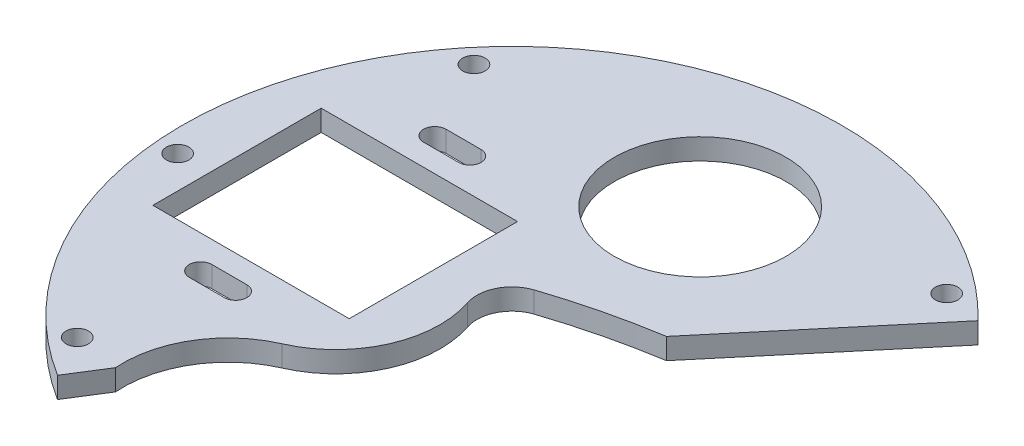
ISO-10303-21;
HEADER;
FILE_DESCRIPTION(('STEP AP214'),'2;1');
FILE_NAME('part.step','',(''),(''),'','','');
FILE_SCHEMA(('AUTOMOTIVE_DESIGN { 1 0 10303 214 1 1 1 1 }'));
ENDSEC;
DATA;
#1=APPLICATION_CONTEXT('core data for automotive mechanical design processes');
#2=APPLICATION_PROTOCOL_DEFINITION('international standard','automotive_design',2000,#1);
#3=PRODUCT_CONTEXT('',#1,'mechanical');
#4=PRODUCT('Part','Part','',(#3));
#5=PRODUCT_RELATED_PRODUCT_CATEGORY('part','',(#4));
#6=PRODUCT_DEFINITION_FORMATION('','',#4);
#7=PRODUCT_DEFINITION_CONTEXT('part definition',#1,'design');
#8=PRODUCT_DEFINITION('design','',#6,#7);
#9=PRODUCT_DEFINITION_SHAPE('','',#8);
#10=(LENGTH_UNIT() NAMED_UNIT(*) SI_UNIT(.MILLI.,.METRE.));
#11=(NAMED_UNIT(*) PLANE_ANGLE_UNIT() SI_UNIT($,.RADIAN.));
#12=(NAMED_UNIT(*) SI_UNIT($,.STERADIAN.) SOLID_ANGLE_UNIT());
#13=UNCERTAINTY_MEASURE_WITH_UNIT(LENGTH_MEASURE(1.E-05),#10,'distance_accuracy_value','');
#14=(GEOMETRIC_REPRESENTATION_CONTEXT(3) GLOBAL_UNCERTAINTY_ASSIGNED_CONTEXT((#13)) GLOBAL_UNIT_ASSIGNED_CONTEXT((#10,
#11,#12)) REPRESENTATION_CONTEXT('',''));
#15=CARTESIAN_POINT('',(0.,0.,0.));
#16=DIRECTION('',(0.,0.,1.));
#17=DIRECTION('',(1.,0.,0.));
#18=AXIS2_PLACEMENT_3D('',#15,#16,#17);
#19=CARTESIAN_POINT('',(0.,3.,15.1));
#20=DIRECTION('',(0.,0.,-1.));
#21=DIRECTION('',(-1.,0.,0.));
#22=AXIS2_PLACEMENT_3D('',#19,#20,#21);
#23=PLANE('',#22);
#24=DIRECTION('',(1.,0.,0.));
#25=VECTOR('',#24,1.);
#26=CARTESIAN_POINT('',(0.,0.,15.1));
#27=LINE('',#26,#25);
#28=CARTESIAN_POINT('',(-27.7045915678253,0.,15.1));
#29=VERTEX_POINT('',#28);
#30=CARTESIAN_POINT('',(-22.7045915678253,0.,15.1));
#31=VERTEX_POINT('',#30);
#32=EDGE_CURVE('E254',#29,#31,#27,.T.);
#33=ORIENTED_EDGE('',*,*,#32,.T.);
#34=DIRECTION('',(0.,-1.,0.));
#35=VECTOR('',#34,1.);
#36=CARTESIAN_POINT('',(-22.7045915678253,3.,15.1));
#37=LINE('',#36,#35);
#38=CARTESIAN_POINT('',(-22.7045915678253,3.,15.1));
#39=VERTEX_POINT('',#38);
#40=EDGE_CURVE('E11',#39,#31,#37,.T.);
#41=ORIENTED_EDGE('',*,*,#40,.F.);
#42=DIRECTION('',(1.,0.,0.));
#43=VECTOR('',#42,1.);
#44=CARTESIAN_POINT('',(0.,3.,15.1));
#45=LINE('',#44,#43);
#46=CARTESIAN_POINT('',(-27.7045915678253,3.,15.1));
#47=VERTEX_POINT('',#46);
#48=EDGE_CURVE('E178',#47,#39,#45,.T.);
#49=ORIENTED_EDGE('',*,*,#48,.F.);
#50=DIRECTION('',(0.,-1.,0.));
#51=VECTOR('',#50,1.);
#52=CARTESIAN_POINT('',(-27.7045915678253,3.,15.1));
#53=LINE('',#52,#51);
#54=EDGE_CURVE('E271',#47,#29,#53,.T.);
#55=ORIENTED_EDGE('',*,*,#54,.T.);
#56=EDGE_LOOP('',(#33,#41,#49,#55));
#57=FACE_BOUND('',#56,.T.);
#58=ADVANCED_FACE('F34',(#57),#23,.F.);
#59=CARTESIAN_POINT('',(-22.7045915678253,3.,16.7));
#60=DIRECTION('',(0.,-1.,0.));
#61=DIRECTION('',(0.,0.,-1.));
#62=AXIS2_PLACEMENT_3D('',#59,#60,#61);
#63=CYLINDRICAL_SURFACE('',#62,1.6);
#64=CARTESIAN_POINT('',(-22.7045915678253,0.,16.7));
#65=DIRECTION('',(0.,1.,0.));
#66=DIRECTION('',(0.,0.,1.));
#67=AXIS2_PLACEMENT_3D('',#64,#65,#66);
#68=CIRCLE('',#67,1.6);
#69=CARTESIAN_POINT('',(-22.7045915678253,0.,18.3));
#70=VERTEX_POINT('',#69);
#71=EDGE_CURVE('E184',#31,#70,#68,.F.);
#72=ORIENTED_EDGE('',*,*,#71,.T.);
#73=DIRECTION('',(0.,-1.,0.));
#74=VECTOR('',#73,1.);
#75=CARTESIAN_POINT('',(-22.7045915678253,3.,18.3));
#76=LINE('',#75,#74);
#77=CARTESIAN_POINT('',(-22.7045915678253,3.,18.3));
#78=VERTEX_POINT('',#77);
#79=EDGE_CURVE('E44',#78,#70,#76,.T.);
#80=ORIENTED_EDGE('',*,*,#79,.F.);
#81=CARTESIAN_POINT('',(-22.7045915678253,3.,16.7));
#82=DIRECTION('',(0.,1.,0.));
#83=DIRECTION('',(0.,0.,1.));
#84=AXIS2_PLACEMENT_3D('',#81,#82,#83);
#85=CIRCLE('',#84,1.6);
#86=EDGE_CURVE('E171',#39,#78,#85,.F.);
#87=ORIENTED_EDGE('',*,*,#86,.F.);
#88=ORIENTED_EDGE('',*,*,#40,.T.);
#89=EDGE_LOOP('',(#72,#80,#87,#88));
#90=FACE_BOUND('',#89,.T.);
#91=ADVANCED_FACE('F183',(#90),#63,.F.);
#92=CARTESIAN_POINT('',(0.,3.,18.3));
#93=DIRECTION('',(0.,0.,-1.));
#94=DIRECTION('',(-1.,0.,0.));
#95=AXIS2_PLACEMENT_3D('',#92,#93,#94);
#96=PLANE('',#95);
#97=DIRECTION('',(1.,0.,0.));
#98=VECTOR('',#97,1.);
#99=CARTESIAN_POINT('',(0.,0.,18.3));
#100=LINE('',#99,#98);
#101=CARTESIAN_POINT('',(-27.7045915678253,0.,18.3));
#102=VERTEX_POINT('',#101);
#103=EDGE_CURVE('E258',#102,#70,#100,.T.);
#104=ORIENTED_EDGE('',*,*,#103,.F.);
#105=DIRECTION('',(0.,-1.,0.));
#106=VECTOR('',#105,1.);
#107=CARTESIAN_POINT('',(-27.7045915678253,3.,18.3));
#108=LINE('',#107,#106);
#109=CARTESIAN_POINT('',(-27.7045915678253,3.,18.3));
#110=VERTEX_POINT('',#109);
#111=EDGE_CURVE('E114',#110,#102,#108,.T.);
#112=ORIENTED_EDGE('',*,*,#111,.F.);
#113=DIRECTION('',(1.,0.,0.));
#114=VECTOR('',#113,1.);
#115=CARTESIAN_POINT('',(0.,3.,18.3));
#116=LINE('',#115,#114);
#117=EDGE_CURVE('E176',#110,#78,#116,.T.);
#118=ORIENTED_EDGE('',*,*,#117,.T.);
#119=ORIENTED_EDGE('',*,*,#79,.T.);
#120=EDGE_LOOP('',(#104,#112,#118,#119));
#121=FACE_BOUND('',#120,.T.);
#122=ADVANCED_FACE('F189',(#121),#96,.T.);
#123=CARTESIAN_POINT('',(-6.8650866636541,3.,33.6154197254964));
#124=DIRECTION('',(0.,-1.,0.));
#125=DIRECTION('',(0.,0.,-1.));
#126=AXIS2_PLACEMENT_3D('',#123,#124,#125);
#127=CYLINDRICAL_SURFACE('',#126,15.);
#128=CARTESIAN_POINT('',(-6.8650866636541,0.,33.6154197254964));
#129=DIRECTION('',(0.,1.,0.));
#130=DIRECTION('',(0.,0.,1.));
#131=AXIS2_PLACEMENT_3D('',#128,#129,#130);
#132=CIRCLE('',#131,15.);
#133=CARTESIAN_POINT('',(-12.8924814955561,0.,19.879681247338));
#134=VERTEX_POINT('',#133);
#135=CARTESIAN_POINT('',(-21.8252277825921,0.,34.7082041056285));
#136=VERTEX_POINT('',#135);
#137=EDGE_CURVE('E233',#134,#136,#132,.T.);
#138=ORIENTED_EDGE('',*,*,#137,.F.);
#139=DIRECTION('',(0.,-1.,0.));
#140=VECTOR('',#139,1.);
#141=CARTESIAN_POINT('',(-12.8924814955561,3.,19.879681247338));
#142=LINE('',#141,#140);
#143=CARTESIAN_POINT('',(-12.8924814955561,3.,19.879681247338));
#144=VERTEX_POINT('',#143);
#145=EDGE_CURVE('E273',#144,#134,#142,.T.);
#146=ORIENTED_EDGE('',*,*,#145,.F.);
#147=CARTESIAN_POINT('',(-6.8650866636541,3.,33.6154197254964));
#148=DIRECTION('',(0.,1.,0.));
#149=DIRECTION('',(0.,0.,1.));
#150=AXIS2_PLACEMENT_3D('',#147,#148,#149);
#151=CIRCLE('',#150,15.);
#152=CARTESIAN_POINT('',(-21.8252277825921,3.,34.7082041056285));
#153=VERTEX_POINT('',#152);
#154=EDGE_CURVE('E344',#144,#153,#151,.T.);
#155=ORIENTED_EDGE('',*,*,#154,.T.);
#156=DIRECTION('',(0.,-1.,0.));
#157=VECTOR('',#156,1.);
#158=CARTESIAN_POINT('',(-21.8252277825921,3.,34.7082041056285));
#159=LINE('',#158,#157);
#160=EDGE_CURVE('E275',#153,#136,#159,.T.);
#161=ORIENTED_EDGE('',*,*,#160,.T.);
#162=EDGE_LOOP('',(#138,#146,#155,#161));
#163=FACE_BOUND('',#162,.T.);
#164=ADVANCED_FACE('F380',(#163),#127,.F.);
#165=CARTESIAN_POINT('',(-18.8720519747655,3.,6.25292895969711));
#166=DIRECTION('',(0.,-1.,0.));
#167=DIRECTION('',(0.,0.,-1.));
#168=AXIS2_PLACEMENT_3D('',#165,#166,#167);
#169=CYLINDRICAL_SURFACE('',#168,14.8809825288708);
#170=CARTESIAN_POINT('',(-18.8720519747655,0.,6.25292895969711));
#171=DIRECTION('',(0.,1.,0.));
#172=DIRECTION('',(0.,0.,1.));
#173=AXIS2_PLACEMENT_3D('',#170,#171,#172);
#174=CIRCLE('',#173,14.8809825288708);
#175=CARTESIAN_POINT('',(-4.74625737117363,0.,1.57259052730837));
#176=VERTEX_POINT('',#175);
#177=EDGE_CURVE('E236',#134,#176,#174,.T.);
#178=ORIENTED_EDGE('',*,*,#177,.T.);
#179=DIRECTION('',(0.,-1.,0.));
#180=VECTOR('',#179,1.);
#181=CARTESIAN_POINT('',(-4.74625737117363,3.,1.57259052730837));
#182=LINE('',#181,#180);
#183=CARTESIAN_POINT('',(-4.74625737117363,3.,1.57259052730837));
#184=VERTEX_POINT('',#183);
#185=EDGE_CURVE('E287',#184,#176,#182,.T.);
#186=ORIENTED_EDGE('',*,*,#185,.F.);
#187=CARTESIAN_POINT('',(-18.8720519747655,3.,6.25292895969711));
#188=DIRECTION('',(0.,1.,0.));
#189=DIRECTION('',(0.,0.,1.));
#190=AXIS2_PLACEMENT_3D('',#187,#188,#189);
#191=CIRCLE('',#190,14.8809825288708);
#192=EDGE_CURVE('E347',#144,#184,#191,.T.);
#193=ORIENTED_EDGE('',*,*,#192,.F.);
#194=ORIENTED_EDGE('',*,*,#145,.T.);
#195=EDGE_LOOP('',(#178,#186,#193,#194));
#196=FACE_BOUND('',#195,.T.);
#197=ADVANCED_FACE('F384',(#196),#169,.T.);
#198=CARTESIAN_POINT('',(0.,3.,0.));
#199=DIRECTION('',(0.,-1.,0.));
#200=DIRECTION('',(0.,0.,-1.));
#201=AXIS2_PLACEMENT_3D('',#198,#199,#200);
#202=CYLINDRICAL_SURFACE('',#201,5.);
#203=CARTESIAN_POINT('',(0.,0.,0.));
#204=DIRECTION('',(0.,1.,0.));
#205=DIRECTION('',(0.,0.,1.));
#206=AXIS2_PLACEMENT_3D('',#203,#204,#205);
#207=CIRCLE('',#206,5.);
#208=CARTESIAN_POINT('',(-1.57019862179585,0.,-4.74704921905286));
#209=VERTEX_POINT('',#208);
#210=EDGE_CURVE('E239',#209,#176,#207,.T.);
#211=ORIENTED_EDGE('',*,*,#210,.F.);
#212=DIRECTION('',(0.,-1.,0.));
#213=VECTOR('',#212,1.);
#214=CARTESIAN_POINT('',(-1.57019862179585,3.,-4.74704921905286));
#215=LINE('',#214,#213);
#216=CARTESIAN_POINT('',(-1.57019862179585,3.,-4.74704921905286));
#217=VERTEX_POINT('',#216);
#218=EDGE_CURVE('E285',#217,#209,#215,.T.);
#219=ORIENTED_EDGE('',*,*,#218,.F.);
#220=CARTESIAN_POINT('',(0.,3.,0.));
#221=DIRECTION('',(0.,1.,0.));
#222=DIRECTION('',(0.,0.,1.));
#223=AXIS2_PLACEMENT_3D('',#220,#221,#222);
#224=CIRCLE('',#223,5.);
#225=EDGE_CURVE('E349',#217,#184,#224,.T.);
#226=ORIENTED_EDGE('',*,*,#225,.T.);
#227=ORIENTED_EDGE('',*,*,#185,.T.);
#228=EDGE_LOOP('',(#211,#219,#226,#227));
#229=FACE_BOUND('',#228,.T.);
#230=ADVANCED_FACE('F393',(#229),#202,.F.);
#231=CARTESIAN_POINT('',(28.5974033294279,3.,86.4561204280244));
#232=DIRECTION('',(0.,-1.,0.));
#233=DIRECTION('',(0.,0.,-1.));
#234=AXIS2_PLACEMENT_3D('',#231,#232,#233);
#235=CYLINDRICAL_SURFACE('',#234,96.0630124510003);
#236=CARTESIAN_POINT('',(28.5974033294279,0.,86.4561204280244));
#237=DIRECTION('',(0.,1.,0.));
#238=DIRECTION('',(0.,0.,1.));
#239=AXIS2_PLACEMENT_3D('',#236,#237,#238);
#240=CIRCLE('',#239,96.0630124510003);
#241=CARTESIAN_POINT('',(13.599748073046,0.,-8.42892949013581));
#242=VERTEX_POINT('',#241);
#243=EDGE_CURVE('E242',#242,#209,#240,.T.);
#244=ORIENTED_EDGE('',*,*,#243,.F.);
#245=DIRECTION('',(0.,-1.,0.));
#246=VECTOR('',#245,1.);
#247=CARTESIAN_POINT('',(13.599748073046,3.,-8.42892949013581));
#248=LINE('',#247,#246);
#249=CARTESIAN_POINT('',(13.599748073046,3.,-8.42892949013581));
#250=VERTEX_POINT('',#249);
#251=EDGE_CURVE('E283',#250,#242,#248,.T.);
#252=ORIENTED_EDGE('',*,*,#251,.F.);
#253=CARTESIAN_POINT('',(28.5974033294279,3.,86.4561204280244));
#254=DIRECTION('',(0.,1.,0.));
#255=DIRECTION('',(0.,0.,1.));
#256=AXIS2_PLACEMENT_3D('',#253,#254,#255);
#257=CIRCLE('',#256,96.0630124510003);
#258=EDGE_CURVE('E352',#250,#217,#257,.T.);
#259=ORIENTED_EDGE('',*,*,#258,.T.);
#260=ORIENTED_EDGE('',*,*,#218,.T.);
#261=EDGE_LOOP('',(#244,#252,#259,#260));
#262=FACE_BOUND('',#261,.T.);
#263=ADVANCED_FACE('F389',(#262),#235,.F.);
#264=CARTESIAN_POINT('',(3.83022221559613,3.,3.21393804843123));
#265=DIRECTION('',(-0.766044443119225,0.,-0.642787609686244));
#266=DIRECTION('',(-0.642787609686245,0.,0.766044443119226));
#267=AXIS2_PLACEMENT_3D('',#264,#265,#266);
#268=PLANE('',#267);
#269=DIRECTION('',(0.642787609686245,0.,-0.766044443119225));
#270=VECTOR('',#269,1.);
#271=CARTESIAN_POINT('',(3.83022221559613,0.,3.21393804843123));
#272=LINE('',#271,#270);
#273=CARTESIAN_POINT('',(33.8697992763153,0.,-32.5858358337194));
#274=VERTEX_POINT('',#273);
#275=EDGE_CURVE('E245',#242,#274,#272,.T.);
#276=ORIENTED_EDGE('',*,*,#275,.T.);
#277=DIRECTION('',(0.,-1.,0.));
#278=VECTOR('',#277,1.);
#279=CARTESIAN_POINT('',(33.8697992763153,3.,-32.5858358337194));
#280=LINE('',#279,#278);
#281=CARTESIAN_POINT('',(33.8697992763153,3.,-32.5858358337194));
#282=VERTEX_POINT('',#281);
#283=EDGE_CURVE('E280',#282,#274,#280,.T.);
#284=ORIENTED_EDGE('',*,*,#283,.F.);
#285=DIRECTION('',(0.642787609686245,0.,-0.766044443119225));
#286=VECTOR('',#285,1.);
#287=CARTESIAN_POINT('',(3.83022221559613,3.,3.21393804843123));
#288=LINE('',#287,#286);
#289=EDGE_CURVE('E355',#250,#282,#288,.T.);
#290=ORIENTED_EDGE('',*,*,#289,.F.);
#291=ORIENTED_EDGE('',*,*,#251,.T.);
#292=EDGE_LOOP('',(#276,#284,#290,#291));
#293=FACE_BOUND('',#292,.T.);
#294=ADVANCED_FACE('F392',(#293),#268,.F.);
#295=CARTESIAN_POINT('',(0.,3.,0.));
#296=DIRECTION('',(0.,-1.,0.));
#297=DIRECTION('',(0.,0.,-1.));
#298=AXIS2_PLACEMENT_3D('',#295,#296,#297);
#299=CYLINDRICAL_SURFACE('',#298,46.9999999999999);
#300=CARTESIAN_POINT('',(0.,0.,0.));
#301=DIRECTION('',(0.,1.,0.));
#302=DIRECTION('',(0.,0.,1.));
#303=AXIS2_PLACEMENT_3D('',#300,#301,#302);
#304=CIRCLE('',#303,46.9999999999999);
#305=CARTESIAN_POINT('',(-25.0191635556543,0.,39.7874534869399));
#306=VERTEX_POINT('',#305);
#307=EDGE_CURVE('E248',#274,#306,#304,.T.);
#308=ORIENTED_EDGE('',*,*,#307,.T.);
#309=DIRECTION('',(0.,-1.,0.));
#310=VECTOR('',#309,1.);
#311=CARTESIAN_POINT('',(-25.0191635556543,3.,39.7874534869399));
#312=LINE('',#311,#310);
#313=CARTESIAN_POINT('',(-25.0191635556543,3.,39.7874534869399));
#314=VERTEX_POINT('',#313);
#315=EDGE_CURVE('E277',#314,#306,#312,.T.);
#316=ORIENTED_EDGE('',*,*,#315,.F.);
#317=CARTESIAN_POINT('',(0.,3.,0.));
#318=DIRECTION('',(0.,1.,0.));
#319=DIRECTION('',(0.,0.,1.));
#320=AXIS2_PLACEMENT_3D('',#317,#318,#319);
#321=CIRCLE('',#320,46.9999999999999);
#322=EDGE_CURVE('E358',#282,#314,#321,.T.);
#323=ORIENTED_EDGE('',*,*,#322,.F.);
#324=ORIENTED_EDGE('',*,*,#283,.T.);
#325=EDGE_LOOP('',(#308,#316,#323,#324));
#326=FACE_BOUND('',#325,.T.);
#327=ADVANCED_FACE('F373',(#326),#299,.T.);
#328=CARTESIAN_POINT('',(-22.7045915678253,3.,-16.7));
#329=DIRECTION('',(0.,-1.,0.));
#330=DIRECTION('',(0.,0.,-1.));
#331=AXIS2_PLACEMENT_3D('',#328,#329,#330);
#332=CYLINDRICAL_SURFACE('',#331,1.6);
#333=CARTESIAN_POINT('',(-22.7045915678253,0.,-16.7));
#334=DIRECTION('',(0.,1.,0.));
#335=DIRECTION('',(0.,0.,1.));
#336=AXIS2_PLACEMENT_3D('',#333,#334,#335);
#337=CIRCLE('',#336,1.6);
#338=CARTESIAN_POINT('',(-22.7045915678253,0.,-15.1));
#339=VERTEX_POINT('',#338);
#340=CARTESIAN_POINT('',(-22.7045915678253,0.,-18.3));
#341=VERTEX_POINT('',#340);
#342=EDGE_CURVE('E215',#339,#341,#337,.T.);
#343=ORIENTED_EDGE('',*,*,#342,.F.);
#344=DIRECTION('',(0.,-1.,0.));
#345=VECTOR('',#344,1.);
#346=CARTESIAN_POINT('',(-22.7045915678253,3.,-15.1));
#347=LINE('',#346,#345);
#348=CARTESIAN_POINT('',(-22.7045915678253,3.,-15.1));
#349=VERTEX_POINT('',#348);
#350=EDGE_CURVE('E278',#349,#339,#347,.T.);
#351=ORIENTED_EDGE('',*,*,#350,.F.);
#352=CARTESIAN_POINT('',(-22.7045915678253,3.,-16.7));
#353=DIRECTION('',(0.,1.,0.));
#354=DIRECTION('',(0.,0.,1.));
#355=AXIS2_PLACEMENT_3D('',#352,#353,#354);
#356=CIRCLE('',#355,1.6);
#357=CARTESIAN_POINT('',(-22.7045915678253,3.,-18.3));
#358=VERTEX_POINT('',#357);
#359=EDGE_CURVE('E322',#349,#358,#356,.T.);
#360=ORIENTED_EDGE('',*,*,#359,.T.);
#361=DIRECTION('',(0.,-1.,0.));
#362=VECTOR('',#361,1.);
#363=CARTESIAN_POINT('',(-22.7045915678253,3.,-18.3));
#364=LINE('',#363,#362);
#365=EDGE_CURVE('E290',#358,#341,#364,.T.);
#366=ORIENTED_EDGE('',*,*,#365,.T.);
#367=EDGE_LOOP('',(#343,#351,#360,#366));
#368=FACE_BOUND('',#367,.T.);
#369=ADVANCED_FACE('F417',(#368),#332,.F.);
#370=CARTESIAN_POINT('',(0.,3.,-15.1));
#371=DIRECTION('',(0.,0.,-1.));
#372=DIRECTION('',(-1.,0.,0.));
#373=AXIS2_PLACEMENT_3D('',#370,#371,#372);
#374=PLANE('',#373);
#375=DIRECTION('',(1.,0.,0.));
#376=VECTOR('',#375,1.);
#377=CARTESIAN_POINT('',(0.,0.,-15.1));
#378=LINE('',#377,#376);
#379=CARTESIAN_POINT('',(-27.7045915678253,0.,-15.1));
#380=VERTEX_POINT('',#379);
#381=EDGE_CURVE('E218',#380,#339,#378,.T.);
#382=ORIENTED_EDGE('',*,*,#381,.F.);
#383=DIRECTION('',(0.,-1.,0.));
#384=VECTOR('',#383,1.);
#385=CARTESIAN_POINT('',(-27.7045915678253,3.,-15.1));
#386=LINE('',#385,#384);
#387=CARTESIAN_POINT('',(-27.7045915678253,3.,-15.1));
#388=VERTEX_POINT('',#387);
#389=EDGE_CURVE('E294',#388,#380,#386,.T.);
#390=ORIENTED_EDGE('',*,*,#389,.F.);
#391=DIRECTION('',(1.,0.,0.));
#392=VECTOR('',#391,1.);
#393=CARTESIAN_POINT('',(0.,3.,-15.1));
#394=LINE('',#393,#392);
#395=EDGE_CURVE('E326',#388,#349,#394,.T.);
#396=ORIENTED_EDGE('',*,*,#395,.T.);
#397=ORIENTED_EDGE('',*,*,#350,.T.);
#398=EDGE_LOOP('',(#382,#390,#396,#397));
#399=FACE_BOUND('',#398,.T.);
#400=ADVANCED_FACE('F433',(#399),#374,.T.);
#401=CARTESIAN_POINT('',(-27.7045915678253,3.,-16.7));
#402=DIRECTION('',(0.,-1.,0.));
#403=DIRECTION('',(0.,0.,-1.));
#404=AXIS2_PLACEMENT_3D('',#401,#402,#403);
#405=CYLINDRICAL_SURFACE('',#404,1.6);
#406=CARTESIAN_POINT('',(-27.7045915678253,0.,-16.7));
#407=DIRECTION('',(0.,1.,0.));
#408=DIRECTION('',(0.,0.,1.));
#409=AXIS2_PLACEMENT_3D('',#406,#407,#408);
#410=CIRCLE('',#409,1.6);
#411=CARTESIAN_POINT('',(-27.7045915678253,0.,-18.3));
#412=VERTEX_POINT('',#411);
#413=EDGE_CURVE('E221',#412,#380,#410,.T.);
#414=ORIENTED_EDGE('',*,*,#413,.F.);
#415=DIRECTION('',(0.,-1.,0.));
#416=VECTOR('',#415,1.);
#417=CARTESIAN_POINT('',(-27.7045915678253,3.,-18.3));
#418=LINE('',#417,#416);
#419=CARTESIAN_POINT('',(-27.7045915678253,3.,-18.3));
#420=VERTEX_POINT('',#419);
#421=EDGE_CURVE('E292',#420,#412,#418,.T.);
#422=ORIENTED_EDGE('',*,*,#421,.F.);
#423=CARTESIAN_POINT('',(-27.7045915678253,3.,-16.7));
#424=DIRECTION('',(0.,1.,0.));
#425=DIRECTION('',(0.,0.,1.));
#426=AXIS2_PLACEMENT_3D('',#423,#424,#425);
#427=CIRCLE('',#426,1.6);
#428=EDGE_CURVE('E333',#420,#388,#427,.T.);
#429=ORIENTED_EDGE('',*,*,#428,.T.);
#430=ORIENTED_EDGE('',*,*,#389,.T.);
#431=EDGE_LOOP('',(#414,#422,#429,#430));
#432=FACE_BOUND('',#431,.T.);
#433=ADVANCED_FACE('F441',(#432),#405,.F.);
#434=CARTESIAN_POINT('',(0.,3.,12.));
#435=DIRECTION('',(0.,0.,-1.));
#436=DIRECTION('',(-1.,0.,0.));
#437=AXIS2_PLACEMENT_3D('',#434,#435,#436);
#438=PLANE('',#437);
#439=DIRECTION('',(1.,0.,0.));
#440=VECTOR('',#439,1.);
#441=CARTESIAN_POINT('',(0.,0.,12.));
#442=LINE('',#441,#440);
#443=CARTESIAN_POINT('',(-39.2045915678253,0.,12.));
#444=VERTEX_POINT('',#443);
#445=CARTESIAN_POINT('',(-11.2045915678253,0.,12.));
#446=VERTEX_POINT('',#445);
#447=EDGE_CURVE('E204',#444,#446,#442,.T.);
#448=ORIENTED_EDGE('',*,*,#447,.F.);
#449=DIRECTION('',(0.,-1.,0.));
#450=VECTOR('',#449,1.);
#451=CARTESIAN_POINT('',(-39.2045915678253,3.,12.));
#452=LINE('',#451,#450);
#453=CARTESIAN_POINT('',(-39.2045915678253,3.,12.));
#454=VERTEX_POINT('',#453);
#455=EDGE_CURVE('E38',#454,#444,#452,.T.);
#456=ORIENTED_EDGE('',*,*,#455,.F.);
#457=DIRECTION('',(1.,0.,0.));
#458=VECTOR('',#457,1.);
#459=CARTESIAN_POINT('',(0.,3.,12.));
#460=LINE('',#459,#458);
#461=CARTESIAN_POINT('',(-11.2045915678253,3.,12.));
#462=VERTEX_POINT('',#461);
#463=EDGE_CURVE('E270',#454,#462,#460,.T.);
#464=ORIENTED_EDGE('',*,*,#463,.T.);
#465=DIRECTION('',(0.,-1.,0.));
#466=VECTOR('',#465,1.);
#467=CARTESIAN_POINT('',(-11.2045915678253,3.,12.));
#468=LINE('',#467,#466);
#469=EDGE_CURVE('E203',#462,#446,#468,.T.);
#470=ORIENTED_EDGE('',*,*,#469,.T.);
#471=EDGE_LOOP('',(#448,#456,#464,#470));
#472=FACE_BOUND('',#471,.T.);
#473=ADVANCED_FACE('F36',(#472),#438,.T.);
#474=CARTESIAN_POINT('',(-39.2045915678253,3.,0.));
#475=DIRECTION('',(1.,0.,0.));
#476=DIRECTION('',(0.,0.,-1.));
#477=AXIS2_PLACEMENT_3D('',#474,#475,#476);
#478=PLANE('',#477);
#479=DIRECTION('',(0.,0.,1.));
#480=VECTOR('',#479,1.);
#481=CARTESIAN_POINT('',(-39.2045915678253,0.,0.));
#482=LINE('',#481,#480);
#483=CARTESIAN_POINT('',(-39.2045915678253,0.,-12.));
#484=VERTEX_POINT('',#483);
#485=EDGE_CURVE('E207',#484,#444,#482,.T.);
#486=ORIENTED_EDGE('',*,*,#485,.F.);
#487=DIRECTION('',(0.,-1.,0.));
#488=VECTOR('',#487,1.);
#489=CARTESIAN_POINT('',(-39.2045915678253,3.,-12.));
#490=LINE('',#489,#488);
#491=CARTESIAN_POINT('',(-39.2045915678253,3.,-12.));
#492=VERTEX_POINT('',#491);
#493=EDGE_CURVE('E300',#492,#484,#490,.T.);
#494=ORIENTED_EDGE('',*,*,#493,.F.);
#495=DIRECTION('',(0.,0.,1.));
#496=VECTOR('',#495,1.);
#497=CARTESIAN_POINT('',(-39.2045915678253,3.,0.));
#498=LINE('',#497,#496);
#499=EDGE_CURVE('E309',#492,#454,#498,.T.);
#500=ORIENTED_EDGE('',*,*,#499,.T.);
#501=ORIENTED_EDGE('',*,*,#455,.T.);
#502=EDGE_LOOP('',(#486,#494,#500,#501));
#503=FACE_BOUND('',#502,.T.);
#504=ADVANCED_FACE('F307',(#503),#478,.T.);
#505=CARTESIAN_POINT('',(0.,3.,-12.));
#506=DIRECTION('',(0.,0.,-1.));
#507=DIRECTION('',(-1.,0.,0.));
#508=AXIS2_PLACEMENT_3D('',#505,#506,#507);
#509=PLANE('',#508);
#510=DIRECTION('',(1.,0.,0.));
#511=VECTOR('',#510,1.);
#512=CARTESIAN_POINT('',(0.,0.,-12.));
#513=LINE('',#512,#511);
#514=CARTESIAN_POINT('',(-11.2045915678253,0.,-12.));
#515=VERTEX_POINT('',#514);
#516=EDGE_CURVE('E210',#484,#515,#513,.T.);
#517=ORIENTED_EDGE('',*,*,#516,.T.);
#518=DIRECTION('',(0.,-1.,0.));
#519=VECTOR('',#518,1.);
#520=CARTESIAN_POINT('',(-11.2045915678253,3.,-12.));
#521=LINE('',#520,#519);
#522=CARTESIAN_POINT('',(-11.2045915678253,3.,-12.));
#523=VERTEX_POINT('',#522);
#524=EDGE_CURVE('E298',#523,#515,#521,.T.);
#525=ORIENTED_EDGE('',*,*,#524,.F.);
#526=DIRECTION('',(1.,0.,0.));
#527=VECTOR('',#526,1.);
#528=CARTESIAN_POINT('',(0.,3.,-12.));
#529=LINE('',#528,#527);
#530=EDGE_CURVE('E323',#492,#523,#529,.T.);
#531=ORIENTED_EDGE('',*,*,#530,.F.);
#532=ORIENTED_EDGE('',*,*,#493,.T.);
#533=EDGE_LOOP('',(#517,#525,#531,#532));
#534=FACE_BOUND('',#533,.T.);
#535=ADVANCED_FACE('F316',(#534),#509,.F.);
#536=CARTESIAN_POINT('',(-33.7059554972578,3.,-28.2826548262047));
#537=DIRECTION('',(0.,-1.,0.));
#538=DIRECTION('',(0.,0.,-1.));
#539=AXIS2_PLACEMENT_3D('',#536,#537,#538);
#540=CYLINDRICAL_SURFACE('',#539,1.6);
#541=CARTESIAN_POINT('',(-33.7059554972578,3.,-28.2826548262047));
#542=DIRECTION('',(0.,1.,0.));
#543=DIRECTION('',(0.,0.,1.));
#544=AXIS2_PLACEMENT_3D('',#541,#542,#543);
#545=CIRCLE('',#544,1.6);
#546=CARTESIAN_POINT('',(-33.7059554972578,3.,-26.6826548262047));
#547=VERTEX_POINT('',#546);
#548=EDGE_CURVE('E197',#547,#547,#545,.T.);
#549=ORIENTED_EDGE('',*,*,#548,.T.);
#550=EDGE_LOOP('',(#549));
#551=FACE_BOUND('',#550,.T.);
#552=CARTESIAN_POINT('',(-33.7059554972578,0.,-28.2826548262047));
#553=DIRECTION('',(0.,1.,0.));
#554=DIRECTION('',(0.,0.,1.));
#555=AXIS2_PLACEMENT_3D('',#552,#553,#554);
#556=CIRCLE('',#555,1.6);
#557=CARTESIAN_POINT('',(-33.7059554972578,0.,-26.6826548262047));
#558=VERTEX_POINT('',#557);
#559=EDGE_CURVE('E264',#558,#558,#556,.T.);
#560=ORIENTED_EDGE('',*,*,#559,.F.);
#561=EDGE_LOOP('',(#560));
#562=FACE_BOUND('',#561,.T.);
#563=ADVANCED_FACE('F466',(#551,#562),#540,.F.);
#564=CARTESIAN_POINT('',(-43.8325667160368,3.,3.83485268089666));
#565=DIRECTION('',(0.,-1.,0.));
#566=DIRECTION('',(0.,0.,-1.));
#567=AXIS2_PLACEMENT_3D('',#564,#565,#566);
#568=CYLINDRICAL_SURFACE('',#567,1.6);
#569=CARTESIAN_POINT('',(-43.8325667160368,3.,3.83485268089666));
#570=DIRECTION('',(0.,1.,0.));
#571=DIRECTION('',(0.,0.,1.));
#572=AXIS2_PLACEMENT_3D('',#569,#570,#571);
#573=CIRCLE('',#572,1.6);
#574=CARTESIAN_POINT('',(-43.8325667160368,3.,5.43485268089666));
#575=VERTEX_POINT('',#574);
#576=EDGE_CURVE('E191',#575,#575,#573,.T.);
#577=ORIENTED_EDGE('',*,*,#576,.T.);
#578=EDGE_LOOP('',(#577));
#579=FACE_BOUND('',#578,.T.);
#580=CARTESIAN_POINT('',(-43.8325667160368,0.,3.83485268089666));
#581=DIRECTION('',(0.,1.,0.));
#582=DIRECTION('',(0.,0.,1.));
#583=AXIS2_PLACEMENT_3D('',#580,#581,#582);
#584=CIRCLE('',#583,1.6);
#585=CARTESIAN_POINT('',(-43.8325667160368,0.,5.43485268089666));
#586=VERTEX_POINT('',#585);
#587=EDGE_CURVE('E261',#586,#586,#584,.T.);
#588=ORIENTED_EDGE('',*,*,#587,.F.);
#589=EDGE_LOOP('',(#588));
#590=FACE_BOUND('',#589,.T.);
#591=ADVANCED_FACE('F473',(#579,#590),#568,.F.);
#592=CARTESIAN_POINT('',(-27.7045915678253,3.,16.7));
#593=DIRECTION('',(0.,-1.,0.));
#594=DIRECTION('',(0.,0.,-1.));
#595=AXIS2_PLACEMENT_3D('',#592,#593,#594);
#596=CYLINDRICAL_SURFACE('',#595,1.6);
#597=CARTESIAN_POINT('',(-27.7045915678253,0.,16.7));
#598=DIRECTION('',(0.,1.,0.));
#599=DIRECTION('',(0.,0.,1.));
#600=AXIS2_PLACEMENT_3D('',#597,#598,#599);
#601=CIRCLE('',#600,1.6);
#602=EDGE_CURVE('E117',#102,#29,#601,.F.);
#603=ORIENTED_EDGE('',*,*,#602,.T.);
#604=ORIENTED_EDGE('',*,*,#54,.F.);
#605=CARTESIAN_POINT('',(-27.7045915678253,3.,16.7));
#606=DIRECTION('',(0.,1.,0.));
#607=DIRECTION('',(0.,0.,1.));
#608=AXIS2_PLACEMENT_3D('',#605,#606,#607);
#609=CIRCLE('',#608,1.6);
#610=EDGE_CURVE('E53',#110,#47,#609,.F.);
#611=ORIENTED_EDGE('',*,*,#610,.F.);
#612=ORIENTED_EDGE('',*,*,#111,.T.);
#613=EDGE_LOOP('',(#603,#604,#611,#612));
#614=FACE_BOUND('',#613,.T.);
#615=ADVANCED_FACE('F414',(#614),#596,.F.);
#616=CARTESIAN_POINT('',(1.02796086657853E-13,3.,0.));
#617=DIRECTION('',(0.846541563551914,0.,0.532322628843712));
#618=DIRECTION('',(0.532322628843712,0.,-0.846541563551914));
#619=AXIS2_PLACEMENT_3D('',#616,#617,#618);
#620=PLANE('',#619);
#621=DIRECTION('',(-0.532322628843712,0.,0.846541563551914));
#622=VECTOR('',#621,1.);
#623=CARTESIAN_POINT('',(1.02796086657853E-13,0.,0.));
#624=LINE('',#623,#622);
#625=EDGE_CURVE('E251',#136,#306,#624,.T.);
#626=ORIENTED_EDGE('',*,*,#625,.F.);
#627=ORIENTED_EDGE('',*,*,#160,.F.);
#628=DIRECTION('',(-0.532322628843712,0.,0.846541563551914));
#629=VECTOR('',#628,1.);
#630=CARTESIAN_POINT('',(1.02796086657853E-13,3.,0.));
#631=LINE('',#630,#629);
#632=EDGE_CURVE('E360',#153,#314,#631,.T.);
#633=ORIENTED_EDGE('',*,*,#632,.T.);
#634=ORIENTED_EDGE('',*,*,#315,.T.);
#635=EDGE_LOOP('',(#626,#627,#633,#634));
#636=FACE_BOUND('',#635,.T.);
#637=ADVANCED_FACE('F365',(#636),#620,.T.);
#638=CARTESIAN_POINT('',(28.2826548262036,3.,-33.7059554972564));
#639=DIRECTION('',(0.,-1.,0.));
#640=DIRECTION('',(0.,0.,-1.));
#641=AXIS2_PLACEMENT_3D('',#638,#639,#640);
#642=CYLINDRICAL_SURFACE('',#641,1.6);
#643=CARTESIAN_POINT('',(28.2826548262036,3.,-33.7059554972564));
#644=DIRECTION('',(0.,1.,0.));
#645=DIRECTION('',(0.,0.,1.));
#646=AXIS2_PLACEMENT_3D('',#643,#644,#645);
#647=CIRCLE('',#646,1.6);
#648=CARTESIAN_POINT('',(28.2826548262036,3.,-32.1059554972564));
#649=VERTEX_POINT('',#648);
#650=EDGE_CURVE('E341',#649,#649,#647,.T.);
#651=ORIENTED_EDGE('',*,*,#650,.T.);
#652=EDGE_LOOP('',(#651));
#653=FACE_BOUND('',#652,.T.);
#654=CARTESIAN_POINT('',(28.2826548262036,0.,-33.7059554972564));
#655=DIRECTION('',(0.,1.,0.));
#656=DIRECTION('',(0.,0.,1.));
#657=AXIS2_PLACEMENT_3D('',#654,#655,#656);
#658=CIRCLE('',#657,1.6);
#659=CARTESIAN_POINT('',(28.2826548262036,0.,-32.1059554972564));
#660=VERTEX_POINT('',#659);
#661=EDGE_CURVE('E230',#660,#660,#658,.T.);
#662=ORIENTED_EDGE('',*,*,#661,.F.);
#663=EDGE_LOOP('',(#662));
#664=FACE_BOUND('',#663,.T.);
#665=ADVANCED_FACE('F413',(#653,#664),#642,.F.);
#666=CARTESIAN_POINT('',(0.,3.,-26.8350347628798));
#667=DIRECTION('',(0.,-1.,0.));
#668=DIRECTION('',(0.,0.,-1.));
#669=AXIS2_PLACEMENT_3D('',#666,#667,#668);
#670=CYLINDRICAL_SURFACE('',#669,12.2474134338651);
#671=CARTESIAN_POINT('',(0.,3.,-26.8350347628798));
#672=DIRECTION('',(0.,1.,0.));
#673=DIRECTION('',(0.,0.,1.));
#674=AXIS2_PLACEMENT_3D('',#671,#672,#673);
#675=CIRCLE('',#674,12.2474134338651);
#676=CARTESIAN_POINT('',(0.,3.,-14.5876213290147));
#677=VERTEX_POINT('',#676);
#678=EDGE_CURVE('E338',#677,#677,#675,.T.);
#679=ORIENTED_EDGE('',*,*,#678,.T.);
#680=EDGE_LOOP('',(#679));
#681=FACE_BOUND('',#680,.T.);
#682=CARTESIAN_POINT('',(0.,0.,-26.8350347628798));
#683=DIRECTION('',(0.,1.,0.));
#684=DIRECTION('',(0.,0.,1.));
#685=AXIS2_PLACEMENT_3D('',#682,#683,#684);
#686=CIRCLE('',#685,12.2474134338651);
#687=CARTESIAN_POINT('',(0.,0.,-14.5876213290147));
#688=VERTEX_POINT('',#687);
#689=EDGE_CURVE('E227',#688,#688,#686,.T.);
#690=ORIENTED_EDGE('',*,*,#689,.F.);
#691=EDGE_LOOP('',(#690));
#692=FACE_BOUND('',#691,.T.);
#693=ADVANCED_FACE('F498',(#681,#692),#670,.F.);
#694=CARTESIAN_POINT('',(0.,3.,-18.3));
#695=DIRECTION('',(0.,0.,-1.));
#696=DIRECTION('',(-1.,0.,0.));
#697=AXIS2_PLACEMENT_3D('',#694,#695,#696);
#698=PLANE('',#697);
#699=DIRECTION('',(1.,0.,0.));
#700=VECTOR('',#699,1.);
#701=CARTESIAN_POINT('',(0.,0.,-18.3));
#702=LINE('',#701,#700);
#703=EDGE_CURVE('E224',#412,#341,#702,.T.);
#704=ORIENTED_EDGE('',*,*,#703,.T.);
#705=ORIENTED_EDGE('',*,*,#365,.F.);
#706=DIRECTION('',(1.,0.,0.));
#707=VECTOR('',#706,1.);
#708=CARTESIAN_POINT('',(0.,3.,-18.3));
#709=LINE('',#708,#707);
#710=EDGE_CURVE('E336',#420,#358,#709,.T.);
#711=ORIENTED_EDGE('',*,*,#710,.F.);
#712=ORIENTED_EDGE('',*,*,#421,.T.);
#713=EDGE_LOOP('',(#704,#705,#711,#712));
#714=FACE_BOUND('',#713,.T.);
#715=ADVANCED_FACE('F506',(#714),#698,.F.);
#716=CARTESIAN_POINT('',(-11.2045915678253,3.,0.));
#717=DIRECTION('',(1.,0.,0.));
#718=DIRECTION('',(0.,0.,-1.));
#719=AXIS2_PLACEMENT_3D('',#716,#717,#718);
#720=PLANE('',#719);
#721=DIRECTION('',(0.,0.,1.));
#722=VECTOR('',#721,1.);
#723=CARTESIAN_POINT('',(-11.2045915678253,0.,0.));
#724=LINE('',#723,#722);
#725=EDGE_CURVE('E212',#515,#446,#724,.T.);
#726=ORIENTED_EDGE('',*,*,#725,.T.);
#727=ORIENTED_EDGE('',*,*,#469,.F.);
#728=DIRECTION('',(0.,0.,1.));
#729=VECTOR('',#728,1.);
#730=CARTESIAN_POINT('',(-11.2045915678253,3.,0.));
#731=LINE('',#730,#729);
#732=EDGE_CURVE('E320',#523,#462,#731,.T.);
#733=ORIENTED_EDGE('',*,*,#732,.F.);
#734=ORIENTED_EDGE('',*,*,#524,.T.);
#735=EDGE_LOOP('',(#726,#727,#733,#734));
#736=FACE_BOUND('',#735,.T.);
#737=ADVANCED_FACE('F319',(#736),#720,.F.);
#738=CARTESIAN_POINT('',(-28.2826548262079,3.,33.7059554972349));
#739=DIRECTION('',(0.,-1.,0.));
#740=DIRECTION('',(0.,0.,-1.));
#741=AXIS2_PLACEMENT_3D('',#738,#739,#740);
#742=CYLINDRICAL_SURFACE('',#741,1.6);
#743=CARTESIAN_POINT('',(-28.2826548262079,3.,33.7059554972349));
#744=DIRECTION('',(0.,1.,0.));
#745=DIRECTION('',(0.,0.,1.));
#746=AXIS2_PLACEMENT_3D('',#743,#744,#745);
#747=CIRCLE('',#746,1.6);
#748=CARTESIAN_POINT('',(-28.2826548262079,3.,35.3059554972349));
#749=VERTEX_POINT('',#748);
#750=EDGE_CURVE('E200',#749,#749,#747,.T.);
#751=ORIENTED_EDGE('',*,*,#750,.T.);
#752=EDGE_LOOP('',(#751));
#753=FACE_BOUND('',#752,.T.);
#754=CARTESIAN_POINT('',(-28.2826548262079,0.,33.7059554972349));
#755=DIRECTION('',(0.,1.,0.));
#756=DIRECTION('',(0.,0.,1.));
#757=AXIS2_PLACEMENT_3D('',#754,#755,#756);
#758=CIRCLE('',#757,1.6);
#759=CARTESIAN_POINT('',(-28.2826548262079,0.,35.3059554972349));
#760=VERTEX_POINT('',#759);
#761=EDGE_CURVE('E267',#760,#760,#758,.T.);
#762=ORIENTED_EDGE('',*,*,#761,.F.);
#763=EDGE_LOOP('',(#762));
#764=FACE_BOUND('',#763,.T.);
#765=ADVANCED_FACE('F521',(#753,#764),#742,.F.);
#766=CARTESIAN_POINT('',(0.,3.,0.));
#767=DIRECTION('',(0.,1.,0.));
#768=DIRECTION('',(0.,0.,1.));
#769=AXIS2_PLACEMENT_3D('',#766,#767,#768);
#770=PLANE('',#769);
#771=ORIENTED_EDGE('',*,*,#463,.F.);
#772=ORIENTED_EDGE('',*,*,#499,.F.);
#773=ORIENTED_EDGE('',*,*,#530,.T.);
#774=ORIENTED_EDGE('',*,*,#732,.T.);
#775=EDGE_LOOP('',(#771,#772,#773,#774));
#776=FACE_BOUND('',#775,.T.);
#777=ORIENTED_EDGE('',*,*,#359,.F.);
#778=ORIENTED_EDGE('',*,*,#395,.F.);
#779=ORIENTED_EDGE('',*,*,#428,.F.);
#780=ORIENTED_EDGE('',*,*,#710,.T.);
#781=EDGE_LOOP('',(#777,#778,#779,#780));
#782=FACE_BOUND('',#781,.T.);
#783=ORIENTED_EDGE('',*,*,#678,.F.);
#784=EDGE_LOOP('',(#783));
#785=FACE_BOUND('',#784,.T.);
#786=ORIENTED_EDGE('',*,*,#650,.F.);
#787=EDGE_LOOP('',(#786));
#788=FACE_BOUND('',#787,.T.);
#789=ORIENTED_EDGE('',*,*,#154,.F.);
#790=ORIENTED_EDGE('',*,*,#192,.T.);
#791=ORIENTED_EDGE('',*,*,#225,.F.);
#792=ORIENTED_EDGE('',*,*,#258,.F.);
#793=ORIENTED_EDGE('',*,*,#289,.T.);
#794=ORIENTED_EDGE('',*,*,#322,.T.);
#795=ORIENTED_EDGE('',*,*,#632,.F.);
#796=EDGE_LOOP('',(#789,#790,#791,#792,#793,#794,#795));
#797=FACE_BOUND('',#796,.T.);
#798=ORIENTED_EDGE('',*,*,#48,.T.);
#799=ORIENTED_EDGE('',*,*,#86,.T.);
#800=ORIENTED_EDGE('',*,*,#117,.F.);
#801=ORIENTED_EDGE('',*,*,#610,.T.);
#802=EDGE_LOOP('',(#798,#799,#800,#801));
#803=FACE_BOUND('',#802,.T.);
#804=ORIENTED_EDGE('',*,*,#576,.F.);
#805=EDGE_LOOP('',(#804));
#806=FACE_BOUND('',#805,.T.);
#807=ORIENTED_EDGE('',*,*,#548,.F.);
#808=EDGE_LOOP('',(#807));
#809=FACE_BOUND('',#808,.T.);
#810=ORIENTED_EDGE('',*,*,#750,.F.);
#811=EDGE_LOOP('',(#810));
#812=FACE_BOUND('',#811,.T.);
#813=ADVANCED_FACE('F173',(#776,#782,#785,#788,#797,#803,#806,#809,#812),#770,.T.);
#814=CARTESIAN_POINT('',(0.,0.,0.));
#815=DIRECTION('',(0.,1.,0.));
#816=DIRECTION('',(0.,0.,1.));
#817=AXIS2_PLACEMENT_3D('',#814,#815,#816);
#818=PLANE('',#817);
#819=ORIENTED_EDGE('',*,*,#447,.T.);
#820=ORIENTED_EDGE('',*,*,#725,.F.);
#821=ORIENTED_EDGE('',*,*,#516,.F.);
#822=ORIENTED_EDGE('',*,*,#485,.T.);
#823=EDGE_LOOP('',(#819,#820,#821,#822));
#824=FACE_BOUND('',#823,.T.);
#825=ORIENTED_EDGE('',*,*,#342,.T.);
#826=ORIENTED_EDGE('',*,*,#703,.F.);
#827=ORIENTED_EDGE('',*,*,#413,.T.);
#828=ORIENTED_EDGE('',*,*,#381,.T.);
#829=EDGE_LOOP('',(#825,#826,#827,#828));
#830=FACE_BOUND('',#829,.T.);
#831=ORIENTED_EDGE('',*,*,#689,.T.);
#832=EDGE_LOOP('',(#831));
#833=FACE_BOUND('',#832,.T.);
#834=ORIENTED_EDGE('',*,*,#661,.T.);
#835=EDGE_LOOP('',(#834));
#836=FACE_BOUND('',#835,.T.);
#837=ORIENTED_EDGE('',*,*,#137,.T.);
#838=ORIENTED_EDGE('',*,*,#625,.T.);
#839=ORIENTED_EDGE('',*,*,#307,.F.);
#840=ORIENTED_EDGE('',*,*,#275,.F.);
#841=ORIENTED_EDGE('',*,*,#243,.T.);
#842=ORIENTED_EDGE('',*,*,#210,.T.);
#843=ORIENTED_EDGE('',*,*,#177,.F.);
#844=EDGE_LOOP('',(#837,#838,#839,#840,#841,#842,#843));
#845=FACE_BOUND('',#844,.T.);
#846=ORIENTED_EDGE('',*,*,#32,.F.);
#847=ORIENTED_EDGE('',*,*,#602,.F.);
#848=ORIENTED_EDGE('',*,*,#103,.T.);
#849=ORIENTED_EDGE('',*,*,#71,.F.);
#850=EDGE_LOOP('',(#846,#847,#848,#849));
#851=FACE_BOUND('',#850,.T.);
#852=ORIENTED_EDGE('',*,*,#587,.T.);
#853=EDGE_LOOP('',(#852));
#854=FACE_BOUND('',#853,.T.);
#855=ORIENTED_EDGE('',*,*,#559,.T.);
#856=EDGE_LOOP('',(#855));
#857=FACE_BOUND('',#856,.T.);
#858=ORIENTED_EDGE('',*,*,#761,.T.);
#859=EDGE_LOOP('',(#858));
#860=FACE_BOUND('',#859,.T.);
#861=ADVANCED_FACE('F313',(#824,#830,#833,#836,#845,#851,#854,#857,#860),#818,.F.);
#862=CLOSED_SHELL('',(#58,#91,#122,#164,#197,#230,#263,#294,#327,#369,#400,#433,#473,#504,#535,
#563,#591,#615,#637,#665,#693,#715,#737,#765,#813,#861));
#863=MANIFOLD_SOLID_BREP('B2',#862);
#864=ADVANCED_BREP_SHAPE_REPRESENTATION('',(#18,#863),#14);
#865=SHAPE_DEFINITION_REPRESENTATION(#9,#864);
ENDSEC;
END-ISO-10303-21;
